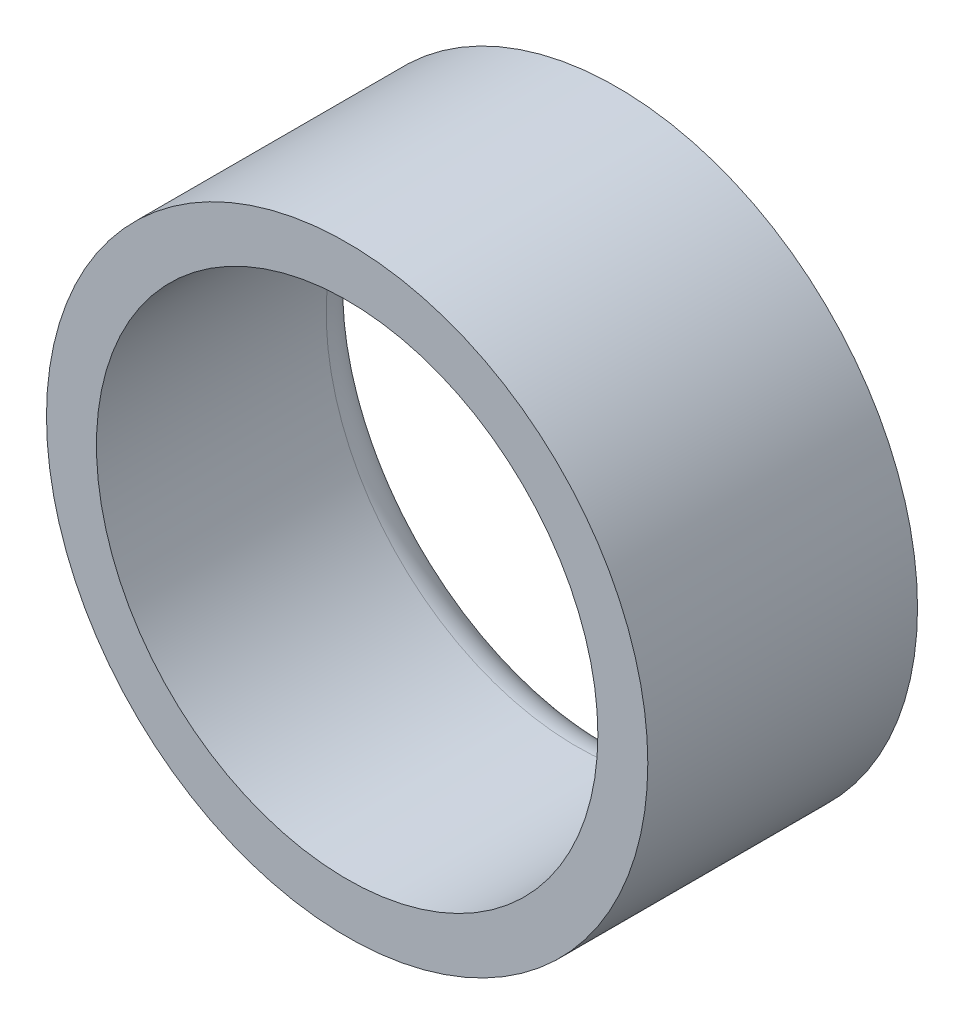
ISO-10303-21;
HEADER;
FILE_DESCRIPTION(('STEP AP214'),'2;1');
FILE_NAME('part.step','',(''),(''),'','','');
FILE_SCHEMA(('AUTOMOTIVE_DESIGN { 1 0 10303 214 1 1 1 1 }'));
ENDSEC;
DATA;
#1=APPLICATION_CONTEXT('core data for automotive mechanical design processes');
#2=APPLICATION_PROTOCOL_DEFINITION('international standard','automotive_design',2000,#1);
#3=PRODUCT_CONTEXT('',#1,'mechanical');
#4=PRODUCT('Part','Part','',(#3));
#5=PRODUCT_RELATED_PRODUCT_CATEGORY('part','',(#4));
#6=PRODUCT_DEFINITION_FORMATION('','',#4);
#7=PRODUCT_DEFINITION_CONTEXT('part definition',#1,'design');
#8=PRODUCT_DEFINITION('design','',#6,#7);
#9=PRODUCT_DEFINITION_SHAPE('','',#8);
#10=(LENGTH_UNIT() NAMED_UNIT(*) SI_UNIT(.MILLI.,.METRE.));
#11=(NAMED_UNIT(*) PLANE_ANGLE_UNIT() SI_UNIT($,.RADIAN.));
#12=(NAMED_UNIT(*) SI_UNIT($,.STERADIAN.) SOLID_ANGLE_UNIT());
#13=UNCERTAINTY_MEASURE_WITH_UNIT(LENGTH_MEASURE(1.E-05),#10,'distance_accuracy_value','');
#14=(GEOMETRIC_REPRESENTATION_CONTEXT(3) GLOBAL_UNCERTAINTY_ASSIGNED_CONTEXT((#13)) GLOBAL_UNIT_ASSIGNED_CONTEXT((#10,
#11,#12)) REPRESENTATION_CONTEXT('',''));
#15=CARTESIAN_POINT('',(0.,0.,0.));
#16=DIRECTION('',(0.,0.,1.));
#17=DIRECTION('',(1.,0.,0.));
#18=AXIS2_PLACEMENT_3D('',#15,#16,#17);
#19=CARTESIAN_POINT('',(0.,0.,17.145));
#20=DIRECTION('',(0.,0.,1.));
#21=DIRECTION('',(1.,0.,0.));
#22=AXIS2_PLACEMENT_3D('',#19,#20,#21);
#23=PLANE('',#22);
#24=CARTESIAN_POINT('',(0.,0.,17.145));
#25=DIRECTION('',(0.,0.,1.));
#26=DIRECTION('',(1.,0.,0.));
#27=AXIS2_PLACEMENT_3D('',#24,#25,#26);
#28=CIRCLE('',#27,19.1135);
#29=CARTESIAN_POINT('',(19.1135,0.,17.145));
#30=VERTEX_POINT('',#29);
#31=EDGE_CURVE('E54',#30,#30,#28,.T.);
#32=ORIENTED_EDGE('',*,*,#31,.T.);
#33=EDGE_LOOP('',(#32));
#34=FACE_BOUND('',#33,.T.);
#35=CARTESIAN_POINT('',(0.,0.,17.145));
#36=DIRECTION('',(0.,0.,1.));
#37=DIRECTION('',(1.,0.,0.));
#38=AXIS2_PLACEMENT_3D('',#35,#36,#37);
#39=CIRCLE('',#38,15.9385);
#40=CARTESIAN_POINT('',(15.9385,0.,17.145));
#41=VERTEX_POINT('',#40);
#42=EDGE_CURVE('E64',#41,#41,#39,.T.);
#43=ORIENTED_EDGE('',*,*,#42,.F.);
#44=EDGE_LOOP('',(#43));
#45=FACE_BOUND('',#44,.T.);
#46=ADVANCED_FACE('F41',(#34,#45),#23,.T.);
#47=CARTESIAN_POINT('',(0.,0.,0.));
#48=DIRECTION('',(0.,0.,1.));
#49=DIRECTION('',(1.,0.,0.));
#50=AXIS2_PLACEMENT_3D('',#47,#48,#49);
#51=PLANE('',#50);
#52=CARTESIAN_POINT('',(0.,0.,0.));
#53=DIRECTION('',(0.,0.,1.));
#54=DIRECTION('',(1.,0.,0.));
#55=AXIS2_PLACEMENT_3D('',#52,#53,#54);
#56=CIRCLE('',#55,18.4785);
#57=CARTESIAN_POINT('',(18.4785,0.,0.));
#58=VERTEX_POINT('',#57);
#59=EDGE_CURVE('E49',#58,#58,#56,.T.);
#60=ORIENTED_EDGE('',*,*,#59,.T.);
#61=EDGE_LOOP('',(#60));
#62=FACE_BOUND('',#61,.T.);
#63=CARTESIAN_POINT('',(0.,0.,0.));
#64=DIRECTION('',(0.,0.,1.));
#65=DIRECTION('',(1.,0.,0.));
#66=AXIS2_PLACEMENT_3D('',#63,#64,#65);
#67=CIRCLE('',#66,19.1135);
#68=CARTESIAN_POINT('',(19.1135,0.,0.));
#69=VERTEX_POINT('',#68);
#70=EDGE_CURVE('E59',#69,#69,#67,.T.);
#71=ORIENTED_EDGE('',*,*,#70,.F.);
#72=EDGE_LOOP('',(#71));
#73=FACE_BOUND('',#72,.T.);
#74=ADVANCED_FACE('F73',(#62,#73),#51,.F.);
#75=CARTESIAN_POINT('',(0.,0.,17.145));
#76=DIRECTION('',(0.,0.,-1.));
#77=DIRECTION('',(-1.,0.,0.));
#78=AXIS2_PLACEMENT_3D('',#75,#76,#77);
#79=CYLINDRICAL_SURFACE('',#78,19.1135);
#80=ORIENTED_EDGE('',*,*,#31,.F.);
#81=EDGE_LOOP('',(#80));
#82=FACE_BOUND('',#81,.T.);
#83=ORIENTED_EDGE('',*,*,#70,.T.);
#84=EDGE_LOOP('',(#83));
#85=FACE_BOUND('',#84,.T.);
#86=ADVANCED_FACE('F79',(#82,#85),#79,.T.);
#87=CARTESIAN_POINT('',(0.,0.,17.145));
#88=DIRECTION('',(0.,0.,-1.));
#89=DIRECTION('',(-1.,0.,0.));
#90=AXIS2_PLACEMENT_3D('',#87,#88,#89);
#91=CYLINDRICAL_SURFACE('',#90,15.9385);
#92=CARTESIAN_POINT('',(0.,0.,2.54));
#93=DIRECTION('',(0.,0.,1.));
#94=DIRECTION('',(1.,0.,0.));
#95=AXIS2_PLACEMENT_3D('',#92,#93,#94);
#96=CIRCLE('',#95,15.9385);
#97=CARTESIAN_POINT('',(15.9385,0.,2.54));
#98=VERTEX_POINT('',#97);
#99=EDGE_CURVE('E10',#98,#98,#96,.F.);
#100=ORIENTED_EDGE('',*,*,#99,.T.);
#101=EDGE_LOOP('',(#100));
#102=FACE_BOUND('',#101,.T.);
#103=ORIENTED_EDGE('',*,*,#42,.T.);
#104=EDGE_LOOP('',(#103));
#105=FACE_BOUND('',#104,.T.);
#106=ADVANCED_FACE('F70',(#102,#105),#91,.F.);
#107=CARTESIAN_POINT('',(0.,0.,2.54));
#108=DIRECTION('',(0.,0.,1.));
#109=DIRECTION('',(1.,0.,0.));
#110=AXIS2_PLACEMENT_3D('',#107,#108,#109);
#111=TOROIDAL_SURFACE('',#110,18.4785,2.54);
#112=ORIENTED_EDGE('',*,*,#99,.F.);
#113=EDGE_LOOP('',(#112));
#114=FACE_BOUND('',#113,.T.);
#115=ORIENTED_EDGE('',*,*,#59,.F.);
#116=EDGE_LOOP('',(#115));
#117=FACE_BOUND('',#116,.T.);
#118=ADVANCED_FACE('F43',(#114,#117),#111,.T.);
#119=CLOSED_SHELL('',(#46,#74,#86,#106,#118));
#120=MANIFOLD_SOLID_BREP('B2',#119);
#121=ADVANCED_BREP_SHAPE_REPRESENTATION('',(#18,#120),#14);
#122=SHAPE_DEFINITION_REPRESENTATION(#9,#121);
ENDSEC;
END-ISO-10303-21;
